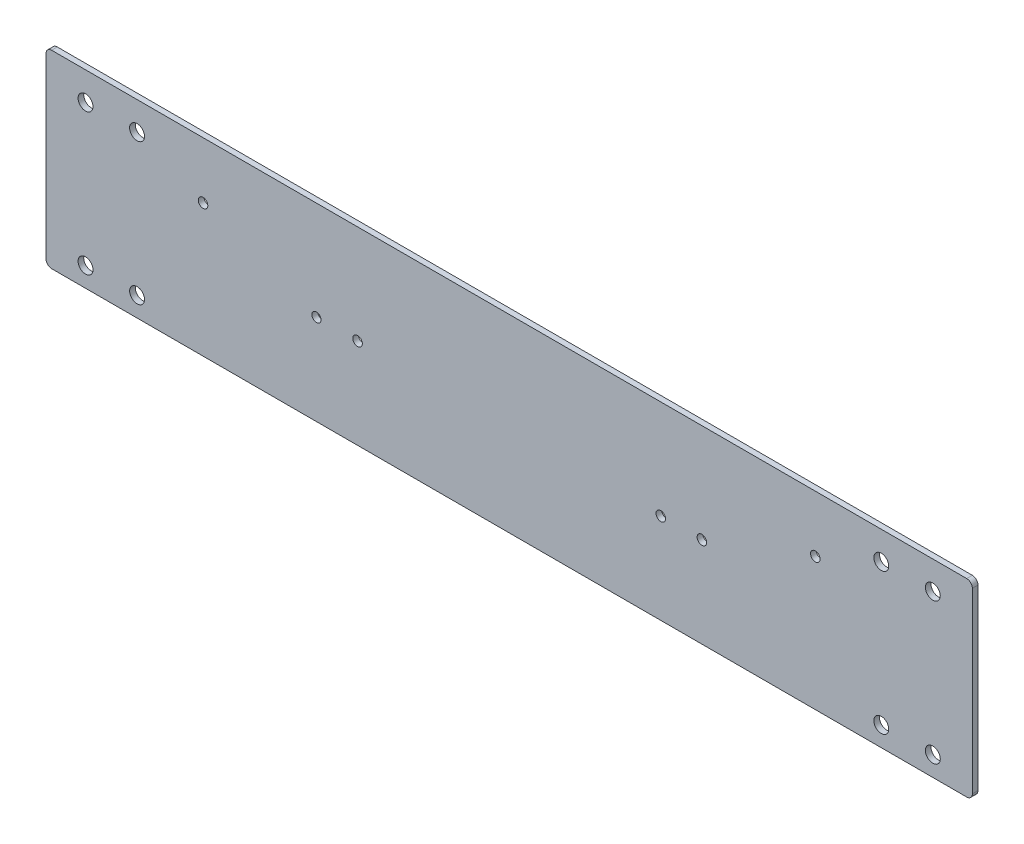
ISO-10303-21;
HEADER;
FILE_DESCRIPTION(('STEP AP214'),'2;1');
FILE_NAME('part.step','',(''),(''),'','','');
FILE_SCHEMA(('AUTOMOTIVE_DESIGN { 1 0 10303 214 1 1 1 1 }'));
ENDSEC;
DATA;
#1=APPLICATION_CONTEXT('core data for automotive mechanical design processes');
#2=APPLICATION_PROTOCOL_DEFINITION('international standard','automotive_design',2000,#1);
#3=PRODUCT_CONTEXT('',#1,'mechanical');
#4=PRODUCT('Part','Part','',(#3));
#5=PRODUCT_RELATED_PRODUCT_CATEGORY('part','',(#4));
#6=PRODUCT_DEFINITION_FORMATION('','',#4);
#7=PRODUCT_DEFINITION_CONTEXT('part definition',#1,'design');
#8=PRODUCT_DEFINITION('design','',#6,#7);
#9=PRODUCT_DEFINITION_SHAPE('','',#8);
#10=(LENGTH_UNIT() NAMED_UNIT(*) SI_UNIT(.MILLI.,.METRE.));
#11=(NAMED_UNIT(*) PLANE_ANGLE_UNIT() SI_UNIT($,.RADIAN.));
#12=(NAMED_UNIT(*) SI_UNIT($,.STERADIAN.) SOLID_ANGLE_UNIT());
#13=UNCERTAINTY_MEASURE_WITH_UNIT(LENGTH_MEASURE(1.E-05),#10,'distance_accuracy_value','');
#14=(GEOMETRIC_REPRESENTATION_CONTEXT(3) GLOBAL_UNCERTAINTY_ASSIGNED_CONTEXT((#13)) GLOBAL_UNIT_ASSIGNED_CONTEXT((#10,
#11,#12)) REPRESENTATION_CONTEXT('',''));
#15=CARTESIAN_POINT('',(0.,0.,0.));
#16=DIRECTION('',(0.,0.,1.));
#17=DIRECTION('',(1.,0.,0.));
#18=AXIS2_PLACEMENT_3D('',#15,#16,#17);
#19=CARTESIAN_POINT('',(-520.7,-106.3625,6.35));
#20=DIRECTION('',(0.,1.,0.));
#21=DIRECTION('',(0.,0.,1.));
#22=AXIS2_PLACEMENT_3D('',#19,#20,#21);
#23=PLANE('',#22);
#24=DIRECTION('',(1.,0.,0.));
#25=VECTOR('',#24,1.);
#26=CARTESIAN_POINT('',(-520.7,-106.3625,0.));
#27=LINE('',#26,#25);
#28=CARTESIAN_POINT('',(-514.35,-106.3625,0.));
#29=VERTEX_POINT('',#28);
#30=CARTESIAN_POINT('',(514.35,-106.3625,0.));
#31=VERTEX_POINT('',#30);
#32=EDGE_CURVE('E160',#29,#31,#27,.T.);
#33=ORIENTED_EDGE('',*,*,#32,.T.);
#34=DIRECTION('',(0.,0.,-1.));
#35=VECTOR('',#34,1.);
#36=CARTESIAN_POINT('',(514.35,-106.3625,6.35));
#37=LINE('',#36,#35);
#38=CARTESIAN_POINT('',(514.35,-106.3625,6.35));
#39=VERTEX_POINT('',#38);
#40=EDGE_CURVE('E147',#31,#39,#37,.F.);
#41=ORIENTED_EDGE('',*,*,#40,.T.);
#42=DIRECTION('',(1.,0.,0.));
#43=VECTOR('',#42,1.);
#44=CARTESIAN_POINT('',(-520.7,-106.3625,6.35));
#45=LINE('',#44,#43);
#46=CARTESIAN_POINT('',(-514.35,-106.3625,6.35));
#47=VERTEX_POINT('',#46);
#48=EDGE_CURVE('E162',#47,#39,#45,.T.);
#49=ORIENTED_EDGE('',*,*,#48,.F.);
#50=DIRECTION('',(0.,0.,-1.));
#51=VECTOR('',#50,1.);
#52=CARTESIAN_POINT('',(-514.35,-106.3625,6.35));
#53=LINE('',#52,#51);
#54=EDGE_CURVE('E144',#47,#29,#53,.T.);
#55=ORIENTED_EDGE('',*,*,#54,.T.);
#56=EDGE_LOOP('',(#33,#41,#49,#55));
#57=FACE_BOUND('',#56,.T.);
#58=ADVANCED_FACE('F35',(#57),#23,.F.);
#59=CARTESIAN_POINT('',(520.7,106.3625,6.35));
#60=DIRECTION('',(1.,0.,0.));
#61=DIRECTION('',(0.,0.,-1.));
#62=AXIS2_PLACEMENT_3D('',#59,#60,#61);
#63=PLANE('',#62);
#64=DIRECTION('',(0.,-1.,0.));
#65=VECTOR('',#64,1.);
#66=CARTESIAN_POINT('',(520.7,106.3625,0.));
#67=LINE('',#66,#65);
#68=CARTESIAN_POINT('',(520.7,100.0125,0.));
#69=VERTEX_POINT('',#68);
#70=CARTESIAN_POINT('',(520.7,-100.0125,0.));
#71=VERTEX_POINT('',#70);
#72=EDGE_CURVE('E118',#69,#71,#67,.T.);
#73=ORIENTED_EDGE('',*,*,#72,.F.);
#74=DIRECTION('',(0.,0.,-1.));
#75=VECTOR('',#74,1.);
#76=CARTESIAN_POINT('',(520.7,100.0125,6.35));
#77=LINE('',#76,#75);
#78=CARTESIAN_POINT('',(520.7,100.0125,6.35));
#79=VERTEX_POINT('',#78);
#80=EDGE_CURVE('E135',#69,#79,#77,.F.);
#81=ORIENTED_EDGE('',*,*,#80,.T.);
#82=DIRECTION('',(0.,-1.,0.));
#83=VECTOR('',#82,1.);
#84=CARTESIAN_POINT('',(520.7,106.3625,6.35));
#85=LINE('',#84,#83);
#86=CARTESIAN_POINT('',(520.7,-100.0125,6.35));
#87=VERTEX_POINT('',#86);
#88=EDGE_CURVE('E172',#79,#87,#85,.T.);
#89=ORIENTED_EDGE('',*,*,#88,.T.);
#90=DIRECTION('',(0.,0.,-1.));
#91=VECTOR('',#90,1.);
#92=CARTESIAN_POINT('',(520.7,-100.0125,0.));
#93=LINE('',#92,#91);
#94=EDGE_CURVE('E132',#87,#71,#93,.T.);
#95=ORIENTED_EDGE('',*,*,#94,.T.);
#96=EDGE_LOOP('',(#73,#81,#89,#95));
#97=FACE_BOUND('',#96,.T.);
#98=ADVANCED_FACE('F308',(#97),#63,.T.);
#99=CARTESIAN_POINT('',(-520.7,106.3625,6.35));
#100=DIRECTION('',(0.,1.,0.));
#101=DIRECTION('',(0.,0.,1.));
#102=AXIS2_PLACEMENT_3D('',#99,#100,#101);
#103=PLANE('',#102);
#104=DIRECTION('',(1.,0.,0.));
#105=VECTOR('',#104,1.);
#106=CARTESIAN_POINT('',(-520.7,106.3625,6.35));
#107=LINE('',#106,#105);
#108=CARTESIAN_POINT('',(-514.35,106.3625,6.35));
#109=VERTEX_POINT('',#108);
#110=CARTESIAN_POINT('',(514.35,106.3625,6.35));
#111=VERTEX_POINT('',#110);
#112=EDGE_CURVE('E123',#109,#111,#107,.T.);
#113=ORIENTED_EDGE('',*,*,#112,.T.);
#114=DIRECTION('',(0.,0.,-1.));
#115=VECTOR('',#114,1.);
#116=CARTESIAN_POINT('',(514.35,106.3625,6.35));
#117=LINE('',#116,#115);
#118=CARTESIAN_POINT('',(514.35,106.3625,0.));
#119=VERTEX_POINT('',#118);
#120=EDGE_CURVE('E110',#111,#119,#117,.T.);
#121=ORIENTED_EDGE('',*,*,#120,.T.);
#122=DIRECTION('',(1.,0.,0.));
#123=VECTOR('',#122,1.);
#124=CARTESIAN_POINT('',(-520.7,106.3625,0.));
#125=LINE('',#124,#123);
#126=CARTESIAN_POINT('',(-514.35,106.3625,0.));
#127=VERTEX_POINT('',#126);
#128=EDGE_CURVE('E103',#127,#119,#125,.T.);
#129=ORIENTED_EDGE('',*,*,#128,.F.);
#130=DIRECTION('',(0.,0.,-1.));
#131=VECTOR('',#130,1.);
#132=CARTESIAN_POINT('',(-514.35,106.3625,6.35));
#133=LINE('',#132,#131);
#134=EDGE_CURVE('E116',#127,#109,#133,.F.);
#135=ORIENTED_EDGE('',*,*,#134,.T.);
#136=EDGE_LOOP('',(#113,#121,#129,#135));
#137=FACE_BOUND('',#136,.T.);
#138=ADVANCED_FACE('F115',(#137),#103,.T.);
#139=CARTESIAN_POINT('',(-520.7,106.3625,6.35));
#140=DIRECTION('',(1.,0.,0.));
#141=DIRECTION('',(0.,0.,-1.));
#142=AXIS2_PLACEMENT_3D('',#139,#140,#141);
#143=PLANE('',#142);
#144=DIRECTION('',(0.,-1.,0.));
#145=VECTOR('',#144,1.);
#146=CARTESIAN_POINT('',(-520.7,106.3625,0.));
#147=LINE('',#146,#145);
#148=CARTESIAN_POINT('',(-520.7,100.0125,0.));
#149=VERTEX_POINT('',#148);
#150=CARTESIAN_POINT('',(-520.7,-100.0125,0.));
#151=VERTEX_POINT('',#150);
#152=EDGE_CURVE('E104',#149,#151,#147,.T.);
#153=ORIENTED_EDGE('',*,*,#152,.T.);
#154=DIRECTION('',(0.,0.,-1.));
#155=VECTOR('',#154,1.);
#156=CARTESIAN_POINT('',(-520.7,-100.0125,6.35));
#157=LINE('',#156,#155);
#158=CARTESIAN_POINT('',(-520.7,-100.0125,6.35));
#159=VERTEX_POINT('',#158);
#160=EDGE_CURVE('E11',#151,#159,#157,.F.);
#161=ORIENTED_EDGE('',*,*,#160,.T.);
#162=DIRECTION('',(0.,-1.,0.));
#163=VECTOR('',#162,1.);
#164=CARTESIAN_POINT('',(-520.7,106.3625,6.35));
#165=LINE('',#164,#163);
#166=CARTESIAN_POINT('',(-520.7,100.0125,6.35));
#167=VERTEX_POINT('',#166);
#168=EDGE_CURVE('E120',#167,#159,#165,.T.);
#169=ORIENTED_EDGE('',*,*,#168,.F.);
#170=DIRECTION('',(0.,0.,-1.));
#171=VECTOR('',#170,1.);
#172=CARTESIAN_POINT('',(-520.7,100.0125,0.));
#173=LINE('',#172,#171);
#174=EDGE_CURVE('E43',#167,#149,#173,.T.);
#175=ORIENTED_EDGE('',*,*,#174,.T.);
#176=EDGE_LOOP('',(#153,#161,#169,#175));
#177=FACE_BOUND('',#176,.T.);
#178=ADVANCED_FACE('F148',(#177),#143,.F.);
#179=CARTESIAN_POINT('',(0.,0.,6.35));
#180=DIRECTION('',(0.,0.,-1.));
#181=DIRECTION('',(-1.,0.,0.));
#182=AXIS2_PLACEMENT_3D('',#179,#180,#181);
#183=PLANE('',#182);
#184=CARTESIAN_POINT('',(344.17,42.8625,6.35));
#185=DIRECTION('',(0.,0.,1.));
#186=DIRECTION('',(1.,0.,0.));
#187=AXIS2_PLACEMENT_3D('',#184,#185,#186);
#188=CIRCLE('',#187,5.35781249998476);
#189=CARTESIAN_POINT('',(349.527812499985,42.8625,6.35));
#190=VERTEX_POINT('',#189);
#191=EDGE_CURVE('E227',#190,#190,#188,.T.);
#192=ORIENTED_EDGE('',*,*,#191,.F.);
#193=EDGE_LOOP('',(#192));
#194=FACE_BOUND('',#193,.T.);
#195=CARTESIAN_POINT('',(-170.434,-4.76249999994408,6.35));
#196=DIRECTION('',(0.,0.,1.));
#197=DIRECTION('',(1.,0.,0.));
#198=AXIS2_PLACEMENT_3D('',#195,#196,#197);
#199=CIRCLE('',#198,5.35781249998366);
#200=CARTESIAN_POINT('',(-165.076187500017,-4.76249999994408,6.35));
#201=VERTEX_POINT('',#200);
#202=EDGE_CURVE('E241',#201,#201,#199,.T.);
#203=ORIENTED_EDGE('',*,*,#202,.F.);
#204=EDGE_LOOP('',(#203));
#205=FACE_BOUND('',#204,.T.);
#206=CARTESIAN_POINT('',(170.434,-4.76249999995435,6.35));
#207=DIRECTION('',(0.,0.,1.));
#208=DIRECTION('',(1.,0.,0.));
#209=AXIS2_PLACEMENT_3D('',#206,#207,#208);
#210=CIRCLE('',#209,5.3578124999858);
#211=CARTESIAN_POINT('',(175.791812499986,-4.76249999995435,6.35));
#212=VERTEX_POINT('',#211);
#213=EDGE_CURVE('E234',#212,#212,#210,.T.);
#214=ORIENTED_EDGE('',*,*,#213,.F.);
#215=EDGE_LOOP('',(#214));
#216=FACE_BOUND('',#215,.T.);
#217=CARTESIAN_POINT('',(216.662,-4.76249999995415,6.35));
#218=DIRECTION('',(0.,0.,1.));
#219=DIRECTION('',(1.,0.,0.));
#220=AXIS2_PLACEMENT_3D('',#217,#218,#219);
#221=CIRCLE('',#220,5.35781249998577);
#222=CARTESIAN_POINT('',(222.019812499986,-4.76249999995415,6.35));
#223=VERTEX_POINT('',#222);
#224=EDGE_CURVE('E251',#223,#223,#221,.T.);
#225=ORIENTED_EDGE('',*,*,#224,.F.);
#226=EDGE_LOOP('',(#225));
#227=FACE_BOUND('',#226,.T.);
#228=CARTESIAN_POINT('',(-344.17,42.8625,6.35));
#229=DIRECTION('',(0.,0.,1.));
#230=DIRECTION('',(1.,0.,0.));
#231=AXIS2_PLACEMENT_3D('',#228,#229,#230);
#232=CIRCLE('',#231,5.3578124999847);
#233=CARTESIAN_POINT('',(-338.812187500015,42.8625,6.35));
#234=VERTEX_POINT('',#233);
#235=EDGE_CURVE('E233',#234,#234,#232,.T.);
#236=ORIENTED_EDGE('',*,*,#235,.F.);
#237=EDGE_LOOP('',(#236));
#238=FACE_BOUND('',#237,.T.);
#239=CARTESIAN_POINT('',(-216.662,-4.76249999994408,6.35));
#240=DIRECTION('',(0.,0.,1.));
#241=DIRECTION('',(1.,0.,0.));
#242=AXIS2_PLACEMENT_3D('',#239,#240,#241);
#243=CIRCLE('',#242,5.15937499998365);
#244=CARTESIAN_POINT('',(-211.502625000016,-4.76249999994408,6.35));
#245=VERTEX_POINT('',#244);
#246=EDGE_CURVE('E221',#245,#245,#243,.T.);
#247=ORIENTED_EDGE('',*,*,#246,.F.);
#248=EDGE_LOOP('',(#247));
#249=FACE_BOUND('',#248,.T.);
#250=CARTESIAN_POINT('',(476.249999999981,-84.1375,6.35));
#251=DIRECTION('',(0.,0.,1.));
#252=DIRECTION('',(1.,0.,0.));
#253=AXIS2_PLACEMENT_3D('',#250,#251,#252);
#254=CIRCLE('',#253,8.382);
#255=CARTESIAN_POINT('',(484.631999999981,-84.1375,6.35));
#256=VERTEX_POINT('',#255);
#257=EDGE_CURVE('E191',#256,#256,#254,.T.);
#258=ORIENTED_EDGE('',*,*,#257,.F.);
#259=EDGE_LOOP('',(#258));
#260=FACE_BOUND('',#259,.T.);
#261=CARTESIAN_POINT('',(-418.338,74.6125,6.35));
#262=DIRECTION('',(0.,0.,1.));
#263=DIRECTION('',(1.,0.,0.));
#264=AXIS2_PLACEMENT_3D('',#261,#262,#263);
#265=CIRCLE('',#264,8.382);
#266=CARTESIAN_POINT('',(-409.956,74.6125,6.35));
#267=VERTEX_POINT('',#266);
#268=EDGE_CURVE('E198',#267,#267,#265,.T.);
#269=ORIENTED_EDGE('',*,*,#268,.F.);
#270=EDGE_LOOP('',(#269));
#271=FACE_BOUND('',#270,.T.);
#272=CARTESIAN_POINT('',(-476.249999999973,74.6125,6.35));
#273=DIRECTION('',(0.,0.,1.));
#274=DIRECTION('',(1.,0.,0.));
#275=AXIS2_PLACEMENT_3D('',#272,#273,#274);
#276=CIRCLE('',#275,8.382);
#277=CARTESIAN_POINT('',(-467.867999999973,74.6125,6.35));
#278=VERTEX_POINT('',#277);
#279=EDGE_CURVE('E179',#278,#278,#276,.T.);
#280=ORIENTED_EDGE('',*,*,#279,.F.);
#281=EDGE_LOOP('',(#280));
#282=FACE_BOUND('',#281,.T.);
#283=CARTESIAN_POINT('',(418.310341603568,74.6125,6.35));
#284=DIRECTION('',(0.,0.,1.));
#285=DIRECTION('',(1.,0.,0.));
#286=AXIS2_PLACEMENT_3D('',#283,#284,#285);
#287=CIRCLE('',#286,8.382);
#288=CARTESIAN_POINT('',(426.692341603568,74.6125,6.35));
#289=VERTEX_POINT('',#288);
#290=EDGE_CURVE('E186',#289,#289,#287,.T.);
#291=ORIENTED_EDGE('',*,*,#290,.F.);
#292=EDGE_LOOP('',(#291));
#293=FACE_BOUND('',#292,.T.);
#294=CARTESIAN_POINT('',(-418.310341686,-84.1375,6.35));
#295=DIRECTION('',(0.,0.,1.));
#296=DIRECTION('',(1.,0.,0.));
#297=AXIS2_PLACEMENT_3D('',#294,#295,#296);
#298=CIRCLE('',#297,8.382);
#299=CARTESIAN_POINT('',(-409.928341686,-84.1375,6.35));
#300=VERTEX_POINT('',#299);
#301=EDGE_CURVE('E215',#300,#300,#298,.T.);
#302=ORIENTED_EDGE('',*,*,#301,.F.);
#303=EDGE_LOOP('',(#302));
#304=FACE_BOUND('',#303,.T.);
#305=CARTESIAN_POINT('',(-476.249999999973,-84.1375,6.35));
#306=DIRECTION('',(0.,0.,1.));
#307=DIRECTION('',(1.,0.,0.));
#308=AXIS2_PLACEMENT_3D('',#305,#306,#307);
#309=CIRCLE('',#308,8.382);
#310=CARTESIAN_POINT('',(-467.867999999973,-84.1375,6.35));
#311=VERTEX_POINT('',#310);
#312=EDGE_CURVE('E203',#311,#311,#309,.T.);
#313=ORIENTED_EDGE('',*,*,#312,.F.);
#314=EDGE_LOOP('',(#313));
#315=FACE_BOUND('',#314,.T.);
#316=CARTESIAN_POINT('',(418.310341686,-84.1375,6.35));
#317=DIRECTION('',(0.,0.,1.));
#318=DIRECTION('',(1.,0.,0.));
#319=AXIS2_PLACEMENT_3D('',#316,#317,#318);
#320=CIRCLE('',#319,8.38199999999994);
#321=CARTESIAN_POINT('',(426.692341686,-84.1375,6.35));
#322=VERTEX_POINT('',#321);
#323=EDGE_CURVE('E210',#322,#322,#320,.T.);
#324=ORIENTED_EDGE('',*,*,#323,.F.);
#325=EDGE_LOOP('',(#324));
#326=FACE_BOUND('',#325,.T.);
#327=CARTESIAN_POINT('',(476.249999999981,74.6125,6.35));
#328=DIRECTION('',(0.,0.,1.));
#329=DIRECTION('',(1.,0.,0.));
#330=AXIS2_PLACEMENT_3D('',#327,#328,#329);
#331=CIRCLE('',#330,8.382);
#332=CARTESIAN_POINT('',(484.631999999981,74.6125,6.35));
#333=VERTEX_POINT('',#332);
#334=EDGE_CURVE('E168',#333,#333,#331,.T.);
#335=ORIENTED_EDGE('',*,*,#334,.F.);
#336=EDGE_LOOP('',(#335));
#337=FACE_BOUND('',#336,.T.);
#338=ORIENTED_EDGE('',*,*,#88,.F.);
#339=CARTESIAN_POINT('',(514.35,100.0125,6.35));
#340=DIRECTION('',(0.,0.,-1.));
#341=DIRECTION('',(-1.,0.,0.));
#342=AXIS2_PLACEMENT_3D('',#339,#340,#341);
#343=CIRCLE('',#342,6.35);
#344=EDGE_CURVE('E142',#79,#111,#343,.F.);
#345=ORIENTED_EDGE('',*,*,#344,.T.);
#346=ORIENTED_EDGE('',*,*,#112,.F.);
#347=CARTESIAN_POINT('',(-514.35,100.0125,6.35));
#348=DIRECTION('',(0.,0.,-1.));
#349=DIRECTION('',(-1.,0.,0.));
#350=AXIS2_PLACEMENT_3D('',#347,#348,#349);
#351=CIRCLE('',#350,6.35);
#352=EDGE_CURVE('E55',#109,#167,#351,.F.);
#353=ORIENTED_EDGE('',*,*,#352,.T.);
#354=ORIENTED_EDGE('',*,*,#168,.T.);
#355=CARTESIAN_POINT('',(-514.35,-100.0125,6.35));
#356=DIRECTION('',(0.,0.,-1.));
#357=DIRECTION('',(-1.,0.,0.));
#358=AXIS2_PLACEMENT_3D('',#355,#356,#357);
#359=CIRCLE('',#358,6.35);
#360=EDGE_CURVE('E138',#159,#47,#359,.F.);
#361=ORIENTED_EDGE('',*,*,#360,.T.);
#362=ORIENTED_EDGE('',*,*,#48,.T.);
#363=CARTESIAN_POINT('',(514.35,-100.0125,6.35));
#364=DIRECTION('',(0.,0.,-1.));
#365=DIRECTION('',(-1.,0.,0.));
#366=AXIS2_PLACEMENT_3D('',#363,#364,#365);
#367=CIRCLE('',#366,6.35);
#368=EDGE_CURVE('E140',#39,#87,#367,.F.);
#369=ORIENTED_EDGE('',*,*,#368,.T.);
#370=EDGE_LOOP('',(#338,#345,#346,#353,#354,#361,#362,#369));
#371=FACE_BOUND('',#370,.T.);
#372=ADVANCED_FACE('F151',(#194,#205,#216,#227,#238,#249,#260,#271,#282,#293,#304,#315,#326,
#337,#371),#183,.F.);
#373=CARTESIAN_POINT('',(0.,0.,0.));
#374=DIRECTION('',(0.,0.,-1.));
#375=DIRECTION('',(-1.,0.,0.));
#376=AXIS2_PLACEMENT_3D('',#373,#374,#375);
#377=PLANE('',#376);
#378=CARTESIAN_POINT('',(344.17,42.8625,0.));
#379=DIRECTION('',(0.,0.,1.));
#380=DIRECTION('',(1.,0.,0.));
#381=AXIS2_PLACEMENT_3D('',#378,#379,#380);
#382=CIRCLE('',#381,5.35781249998476);
#383=CARTESIAN_POINT('',(349.527812499985,42.8625,0.));
#384=VERTEX_POINT('',#383);
#385=EDGE_CURVE('E230',#384,#384,#382,.T.);
#386=ORIENTED_EDGE('',*,*,#385,.T.);
#387=EDGE_LOOP('',(#386));
#388=FACE_BOUND('',#387,.T.);
#389=CARTESIAN_POINT('',(-170.434,-4.76249999994408,0.));
#390=DIRECTION('',(0.,0.,1.));
#391=DIRECTION('',(1.,0.,0.));
#392=AXIS2_PLACEMENT_3D('',#389,#390,#391);
#393=CIRCLE('',#392,5.35781249998366);
#394=CARTESIAN_POINT('',(-165.076187500017,-4.76249999994408,0.));
#395=VERTEX_POINT('',#394);
#396=EDGE_CURVE('E224',#395,#395,#393,.T.);
#397=ORIENTED_EDGE('',*,*,#396,.T.);
#398=EDGE_LOOP('',(#397));
#399=FACE_BOUND('',#398,.T.);
#400=CARTESIAN_POINT('',(170.434,-4.76249999995435,0.));
#401=DIRECTION('',(0.,0.,1.));
#402=DIRECTION('',(1.,0.,0.));
#403=AXIS2_PLACEMENT_3D('',#400,#401,#402);
#404=CIRCLE('',#403,5.3578124999858);
#405=CARTESIAN_POINT('',(175.791812499986,-4.76249999995435,0.));
#406=VERTEX_POINT('',#405);
#407=EDGE_CURVE('E237',#406,#406,#404,.T.);
#408=ORIENTED_EDGE('',*,*,#407,.T.);
#409=EDGE_LOOP('',(#408));
#410=FACE_BOUND('',#409,.T.);
#411=CARTESIAN_POINT('',(216.662,-4.76249999995415,0.));
#412=DIRECTION('',(0.,0.,1.));
#413=DIRECTION('',(1.,0.,0.));
#414=AXIS2_PLACEMENT_3D('',#411,#412,#413);
#415=CIRCLE('',#414,5.35781249998577);
#416=CARTESIAN_POINT('',(222.019812499986,-4.76249999995415,0.));
#417=VERTEX_POINT('',#416);
#418=EDGE_CURVE('E238',#417,#417,#415,.T.);
#419=ORIENTED_EDGE('',*,*,#418,.T.);
#420=EDGE_LOOP('',(#419));
#421=FACE_BOUND('',#420,.T.);
#422=CARTESIAN_POINT('',(-344.17,42.8625,0.));
#423=DIRECTION('',(0.,0.,1.));
#424=DIRECTION('',(1.,0.,0.));
#425=AXIS2_PLACEMENT_3D('',#422,#423,#424);
#426=CIRCLE('',#425,5.3578124999847);
#427=CARTESIAN_POINT('',(-338.812187500015,42.8625,0.));
#428=VERTEX_POINT('',#427);
#429=EDGE_CURVE('E248',#428,#428,#426,.T.);
#430=ORIENTED_EDGE('',*,*,#429,.T.);
#431=EDGE_LOOP('',(#430));
#432=FACE_BOUND('',#431,.T.);
#433=CARTESIAN_POINT('',(-216.662,-4.76249999994408,0.));
#434=DIRECTION('',(0.,0.,1.));
#435=DIRECTION('',(1.,0.,0.));
#436=AXIS2_PLACEMENT_3D('',#433,#434,#435);
#437=CIRCLE('',#436,5.15937499998365);
#438=CARTESIAN_POINT('',(-211.502625000016,-4.76249999994408,0.));
#439=VERTEX_POINT('',#438);
#440=EDGE_CURVE('E218',#439,#439,#437,.T.);
#441=ORIENTED_EDGE('',*,*,#440,.T.);
#442=EDGE_LOOP('',(#441));
#443=FACE_BOUND('',#442,.T.);
#444=CARTESIAN_POINT('',(476.249999999981,-84.1375,0.));
#445=DIRECTION('',(0.,0.,1.));
#446=DIRECTION('',(1.,0.,0.));
#447=AXIS2_PLACEMENT_3D('',#444,#445,#446);
#448=CIRCLE('',#447,8.382);
#449=CARTESIAN_POINT('',(484.631999999981,-84.1375,0.));
#450=VERTEX_POINT('',#449);
#451=EDGE_CURVE('E194',#450,#450,#448,.T.);
#452=ORIENTED_EDGE('',*,*,#451,.T.);
#453=EDGE_LOOP('',(#452));
#454=FACE_BOUND('',#453,.T.);
#455=CARTESIAN_POINT('',(-418.338,74.6125,0.));
#456=DIRECTION('',(0.,0.,1.));
#457=DIRECTION('',(1.,0.,0.));
#458=AXIS2_PLACEMENT_3D('',#455,#456,#457);
#459=CIRCLE('',#458,8.382);
#460=CARTESIAN_POINT('',(-409.956,74.6125,0.));
#461=VERTEX_POINT('',#460);
#462=EDGE_CURVE('E183',#461,#461,#459,.T.);
#463=ORIENTED_EDGE('',*,*,#462,.T.);
#464=EDGE_LOOP('',(#463));
#465=FACE_BOUND('',#464,.T.);
#466=CARTESIAN_POINT('',(-476.249999999973,74.6125,0.));
#467=DIRECTION('',(0.,0.,1.));
#468=DIRECTION('',(1.,0.,0.));
#469=AXIS2_PLACEMENT_3D('',#466,#467,#468);
#470=CIRCLE('',#469,8.382);
#471=CARTESIAN_POINT('',(-467.867999999973,74.6125,0.));
#472=VERTEX_POINT('',#471);
#473=EDGE_CURVE('E182',#472,#472,#470,.T.);
#474=ORIENTED_EDGE('',*,*,#473,.T.);
#475=EDGE_LOOP('',(#474));
#476=FACE_BOUND('',#475,.T.);
#477=CARTESIAN_POINT('',(418.310341603568,74.6125,0.));
#478=DIRECTION('',(0.,0.,1.));
#479=DIRECTION('',(1.,0.,0.));
#480=AXIS2_PLACEMENT_3D('',#477,#478,#479);
#481=CIRCLE('',#480,8.382);
#482=CARTESIAN_POINT('',(426.692341603568,74.6125,0.));
#483=VERTEX_POINT('',#482);
#484=EDGE_CURVE('E177',#483,#483,#481,.T.);
#485=ORIENTED_EDGE('',*,*,#484,.T.);
#486=EDGE_LOOP('',(#485));
#487=FACE_BOUND('',#486,.T.);
#488=CARTESIAN_POINT('',(-418.310341686,-84.1375,0.));
#489=DIRECTION('',(0.,0.,1.));
#490=DIRECTION('',(1.,0.,0.));
#491=AXIS2_PLACEMENT_3D('',#488,#489,#490);
#492=CIRCLE('',#491,8.382);
#493=CARTESIAN_POINT('',(-409.928341686,-84.1375,0.));
#494=VERTEX_POINT('',#493);
#495=EDGE_CURVE('E207',#494,#494,#492,.T.);
#496=ORIENTED_EDGE('',*,*,#495,.T.);
#497=EDGE_LOOP('',(#496));
#498=FACE_BOUND('',#497,.T.);
#499=CARTESIAN_POINT('',(-476.249999999973,-84.1375,0.));
#500=DIRECTION('',(0.,0.,1.));
#501=DIRECTION('',(1.,0.,0.));
#502=AXIS2_PLACEMENT_3D('',#499,#500,#501);
#503=CIRCLE('',#502,8.382);
#504=CARTESIAN_POINT('',(-467.867999999973,-84.1375,0.));
#505=VERTEX_POINT('',#504);
#506=EDGE_CURVE('E206',#505,#505,#503,.T.);
#507=ORIENTED_EDGE('',*,*,#506,.T.);
#508=EDGE_LOOP('',(#507));
#509=FACE_BOUND('',#508,.T.);
#510=CARTESIAN_POINT('',(418.310341686,-84.1375,0.));
#511=DIRECTION('',(0.,0.,1.));
#512=DIRECTION('',(1.,0.,0.));
#513=AXIS2_PLACEMENT_3D('',#510,#511,#512);
#514=CIRCLE('',#513,8.38199999999994);
#515=CARTESIAN_POINT('',(426.692341686,-84.1375,0.));
#516=VERTEX_POINT('',#515);
#517=EDGE_CURVE('E195',#516,#516,#514,.T.);
#518=ORIENTED_EDGE('',*,*,#517,.T.);
#519=EDGE_LOOP('',(#518));
#520=FACE_BOUND('',#519,.T.);
#521=CARTESIAN_POINT('',(476.249999999981,74.6125,0.));
#522=DIRECTION('',(0.,0.,1.));
#523=DIRECTION('',(1.,0.,0.));
#524=AXIS2_PLACEMENT_3D('',#521,#522,#523);
#525=CIRCLE('',#524,8.382);
#526=CARTESIAN_POINT('',(484.631999999981,74.6125,0.));
#527=VERTEX_POINT('',#526);
#528=EDGE_CURVE('E164',#527,#527,#525,.T.);
#529=ORIENTED_EDGE('',*,*,#528,.T.);
#530=EDGE_LOOP('',(#529));
#531=FACE_BOUND('',#530,.T.);
#532=ORIENTED_EDGE('',*,*,#128,.T.);
#533=CARTESIAN_POINT('',(514.35,100.0125,0.));
#534=DIRECTION('',(0.,0.,-1.));
#535=DIRECTION('',(-1.,0.,0.));
#536=AXIS2_PLACEMENT_3D('',#533,#534,#535);
#537=CIRCLE('',#536,6.35);
#538=EDGE_CURVE('E130',#119,#69,#537,.T.);
#539=ORIENTED_EDGE('',*,*,#538,.T.);
#540=ORIENTED_EDGE('',*,*,#72,.T.);
#541=CARTESIAN_POINT('',(514.35,-100.0125,0.));
#542=DIRECTION('',(0.,0.,-1.));
#543=DIRECTION('',(-1.,0.,0.));
#544=AXIS2_PLACEMENT_3D('',#541,#542,#543);
#545=CIRCLE('',#544,6.35);
#546=EDGE_CURVE('E128',#71,#31,#545,.T.);
#547=ORIENTED_EDGE('',*,*,#546,.T.);
#548=ORIENTED_EDGE('',*,*,#32,.F.);
#549=CARTESIAN_POINT('',(-514.35,-100.0125,0.));
#550=DIRECTION('',(0.,0.,-1.));
#551=DIRECTION('',(-1.,0.,0.));
#552=AXIS2_PLACEMENT_3D('',#549,#550,#551);
#553=CIRCLE('',#552,6.35);
#554=EDGE_CURVE('E109',#29,#151,#553,.T.);
#555=ORIENTED_EDGE('',*,*,#554,.T.);
#556=ORIENTED_EDGE('',*,*,#152,.F.);
#557=CARTESIAN_POINT('',(-514.35,100.0125,0.));
#558=DIRECTION('',(0.,0.,-1.));
#559=DIRECTION('',(-1.,0.,0.));
#560=AXIS2_PLACEMENT_3D('',#557,#558,#559);
#561=CIRCLE('',#560,6.35);
#562=EDGE_CURVE('E100',#149,#127,#561,.T.);
#563=ORIENTED_EDGE('',*,*,#562,.T.);
#564=EDGE_LOOP('',(#532,#539,#540,#547,#548,#555,#556,#563));
#565=FACE_BOUND('',#564,.T.);
#566=ADVANCED_FACE('F102',(#388,#399,#410,#421,#432,#443,#454,#465,#476,#487,#498,#509,#520,
#531,#565),#377,.T.);
#567=CARTESIAN_POINT('',(476.249999999981,74.6125,0.));
#568=DIRECTION('',(0.,0.,1.));
#569=DIRECTION('',(1.,0.,0.));
#570=AXIS2_PLACEMENT_3D('',#567,#568,#569);
#571=CYLINDRICAL_SURFACE('',#570,8.382);
#572=ORIENTED_EDGE('',*,*,#528,.F.);
#573=EDGE_LOOP('',(#572));
#574=FACE_BOUND('',#573,.T.);
#575=ORIENTED_EDGE('',*,*,#334,.T.);
#576=EDGE_LOOP('',(#575));
#577=FACE_BOUND('',#576,.T.);
#578=ADVANCED_FACE('F291',(#574,#577),#571,.F.);
#579=CARTESIAN_POINT('',(418.310341686,-84.1375,0.));
#580=DIRECTION('',(0.,0.,1.));
#581=DIRECTION('',(1.,0.,0.));
#582=AXIS2_PLACEMENT_3D('',#579,#580,#581);
#583=CYLINDRICAL_SURFACE('',#582,8.38199999999994);
#584=ORIENTED_EDGE('',*,*,#517,.F.);
#585=EDGE_LOOP('',(#584));
#586=FACE_BOUND('',#585,.T.);
#587=ORIENTED_EDGE('',*,*,#323,.T.);
#588=EDGE_LOOP('',(#587));
#589=FACE_BOUND('',#588,.T.);
#590=ADVANCED_FACE('F293',(#586,#589),#583,.F.);
#591=CARTESIAN_POINT('',(-476.249999999973,-84.1375,0.));
#592=DIRECTION('',(0.,0.,1.));
#593=DIRECTION('',(1.,0.,0.));
#594=AXIS2_PLACEMENT_3D('',#591,#592,#593);
#595=CYLINDRICAL_SURFACE('',#594,8.382);
#596=ORIENTED_EDGE('',*,*,#506,.F.);
#597=EDGE_LOOP('',(#596));
#598=FACE_BOUND('',#597,.T.);
#599=ORIENTED_EDGE('',*,*,#312,.T.);
#600=EDGE_LOOP('',(#599));
#601=FACE_BOUND('',#600,.T.);
#602=ADVANCED_FACE('F300',(#598,#601),#595,.F.);
#603=CARTESIAN_POINT('',(-418.310341686,-84.1375,0.));
#604=DIRECTION('',(0.,0.,1.));
#605=DIRECTION('',(1.,0.,0.));
#606=AXIS2_PLACEMENT_3D('',#603,#604,#605);
#607=CYLINDRICAL_SURFACE('',#606,8.382);
#608=ORIENTED_EDGE('',*,*,#495,.F.);
#609=EDGE_LOOP('',(#608));
#610=FACE_BOUND('',#609,.T.);
#611=ORIENTED_EDGE('',*,*,#301,.T.);
#612=EDGE_LOOP('',(#611));
#613=FACE_BOUND('',#612,.T.);
#614=ADVANCED_FACE('F479',(#610,#613),#607,.F.);
#615=CARTESIAN_POINT('',(418.310341603568,74.6125,0.));
#616=DIRECTION('',(0.,0.,1.));
#617=DIRECTION('',(1.,0.,0.));
#618=AXIS2_PLACEMENT_3D('',#615,#616,#617);
#619=CYLINDRICAL_SURFACE('',#618,8.382);
#620=ORIENTED_EDGE('',*,*,#484,.F.);
#621=EDGE_LOOP('',(#620));
#622=FACE_BOUND('',#621,.T.);
#623=ORIENTED_EDGE('',*,*,#290,.T.);
#624=EDGE_LOOP('',(#623));
#625=FACE_BOUND('',#624,.T.);
#626=ADVANCED_FACE('F470',(#622,#625),#619,.F.);
#627=CARTESIAN_POINT('',(-476.249999999973,74.6125,0.));
#628=DIRECTION('',(0.,0.,1.));
#629=DIRECTION('',(1.,0.,0.));
#630=AXIS2_PLACEMENT_3D('',#627,#628,#629);
#631=CYLINDRICAL_SURFACE('',#630,8.382);
#632=ORIENTED_EDGE('',*,*,#473,.F.);
#633=EDGE_LOOP('',(#632));
#634=FACE_BOUND('',#633,.T.);
#635=ORIENTED_EDGE('',*,*,#279,.T.);
#636=EDGE_LOOP('',(#635));
#637=FACE_BOUND('',#636,.T.);
#638=ADVANCED_FACE('F460',(#634,#637),#631,.F.);
#639=CARTESIAN_POINT('',(-418.338,74.6125,0.));
#640=DIRECTION('',(0.,0.,1.));
#641=DIRECTION('',(1.,0.,0.));
#642=AXIS2_PLACEMENT_3D('',#639,#640,#641);
#643=CYLINDRICAL_SURFACE('',#642,8.382);
#644=ORIENTED_EDGE('',*,*,#462,.F.);
#645=EDGE_LOOP('',(#644));
#646=FACE_BOUND('',#645,.T.);
#647=ORIENTED_EDGE('',*,*,#268,.T.);
#648=EDGE_LOOP('',(#647));
#649=FACE_BOUND('',#648,.T.);
#650=ADVANCED_FACE('F450',(#646,#649),#643,.F.);
#651=CARTESIAN_POINT('',(476.249999999981,-84.1375,0.));
#652=DIRECTION('',(0.,0.,1.));
#653=DIRECTION('',(1.,0.,0.));
#654=AXIS2_PLACEMENT_3D('',#651,#652,#653);
#655=CYLINDRICAL_SURFACE('',#654,8.382);
#656=ORIENTED_EDGE('',*,*,#451,.F.);
#657=EDGE_LOOP('',(#656));
#658=FACE_BOUND('',#657,.T.);
#659=ORIENTED_EDGE('',*,*,#257,.T.);
#660=EDGE_LOOP('',(#659));
#661=FACE_BOUND('',#660,.T.);
#662=ADVANCED_FACE('F440',(#658,#661),#655,.F.);
#663=CARTESIAN_POINT('',(-216.662,-4.76249999994408,0.));
#664=DIRECTION('',(0.,0.,1.));
#665=DIRECTION('',(1.,0.,0.));
#666=AXIS2_PLACEMENT_3D('',#663,#664,#665);
#667=CYLINDRICAL_SURFACE('',#666,5.15937499998365);
#668=ORIENTED_EDGE('',*,*,#440,.F.);
#669=EDGE_LOOP('',(#668));
#670=FACE_BOUND('',#669,.T.);
#671=ORIENTED_EDGE('',*,*,#246,.T.);
#672=EDGE_LOOP('',(#671));
#673=FACE_BOUND('',#672,.T.);
#674=ADVANCED_FACE('F430',(#670,#673),#667,.F.);
#675=CARTESIAN_POINT('',(-344.17,42.8625,0.));
#676=DIRECTION('',(0.,0.,1.));
#677=DIRECTION('',(1.,0.,0.));
#678=AXIS2_PLACEMENT_3D('',#675,#676,#677);
#679=CYLINDRICAL_SURFACE('',#678,5.3578124999847);
#680=ORIENTED_EDGE('',*,*,#429,.F.);
#681=EDGE_LOOP('',(#680));
#682=FACE_BOUND('',#681,.T.);
#683=ORIENTED_EDGE('',*,*,#235,.T.);
#684=EDGE_LOOP('',(#683));
#685=FACE_BOUND('',#684,.T.);
#686=ADVANCED_FACE('F263',(#682,#685),#679,.F.);
#687=CARTESIAN_POINT('',(216.662,-4.76249999995415,0.));
#688=DIRECTION('',(0.,0.,1.));
#689=DIRECTION('',(1.,0.,0.));
#690=AXIS2_PLACEMENT_3D('',#687,#688,#689);
#691=CYLINDRICAL_SURFACE('',#690,5.35781249998577);
#692=ORIENTED_EDGE('',*,*,#418,.F.);
#693=EDGE_LOOP('',(#692));
#694=FACE_BOUND('',#693,.T.);
#695=ORIENTED_EDGE('',*,*,#224,.T.);
#696=EDGE_LOOP('',(#695));
#697=FACE_BOUND('',#696,.T.);
#698=ADVANCED_FACE('F259',(#694,#697),#691,.F.);
#699=CARTESIAN_POINT('',(170.434,-4.76249999995435,0.));
#700=DIRECTION('',(0.,0.,1.));
#701=DIRECTION('',(1.,0.,0.));
#702=AXIS2_PLACEMENT_3D('',#699,#700,#701);
#703=CYLINDRICAL_SURFACE('',#702,5.3578124999858);
#704=ORIENTED_EDGE('',*,*,#407,.F.);
#705=EDGE_LOOP('',(#704));
#706=FACE_BOUND('',#705,.T.);
#707=ORIENTED_EDGE('',*,*,#213,.T.);
#708=EDGE_LOOP('',(#707));
#709=FACE_BOUND('',#708,.T.);
#710=ADVANCED_FACE('F262',(#706,#709),#703,.F.);
#711=CARTESIAN_POINT('',(-170.434,-4.76249999994408,0.));
#712=DIRECTION('',(0.,0.,1.));
#713=DIRECTION('',(1.,0.,0.));
#714=AXIS2_PLACEMENT_3D('',#711,#712,#713);
#715=CYLINDRICAL_SURFACE('',#714,5.35781249998366);
#716=ORIENTED_EDGE('',*,*,#396,.F.);
#717=EDGE_LOOP('',(#716));
#718=FACE_BOUND('',#717,.T.);
#719=ORIENTED_EDGE('',*,*,#202,.T.);
#720=EDGE_LOOP('',(#719));
#721=FACE_BOUND('',#720,.T.);
#722=ADVANCED_FACE('F396',(#718,#721),#715,.F.);
#723=CARTESIAN_POINT('',(344.17,42.8625,0.));
#724=DIRECTION('',(0.,0.,1.));
#725=DIRECTION('',(1.,0.,0.));
#726=AXIS2_PLACEMENT_3D('',#723,#724,#725);
#727=CYLINDRICAL_SURFACE('',#726,5.35781249998476);
#728=ORIENTED_EDGE('',*,*,#385,.F.);
#729=EDGE_LOOP('',(#728));
#730=FACE_BOUND('',#729,.T.);
#731=ORIENTED_EDGE('',*,*,#191,.T.);
#732=EDGE_LOOP('',(#731));
#733=FACE_BOUND('',#732,.T.);
#734=ADVANCED_FACE('F321',(#730,#733),#727,.F.);
#735=CARTESIAN_POINT('',(514.35,100.0125,6.35));
#736=DIRECTION('',(0.,0.,-1.));
#737=DIRECTION('',(-1.,0.,0.));
#738=AXIS2_PLACEMENT_3D('',#735,#736,#737);
#739=CYLINDRICAL_SURFACE('',#738,6.35);
#740=ORIENTED_EDGE('',*,*,#344,.F.);
#741=ORIENTED_EDGE('',*,*,#80,.F.);
#742=ORIENTED_EDGE('',*,*,#538,.F.);
#743=ORIENTED_EDGE('',*,*,#120,.F.);
#744=EDGE_LOOP('',(#740,#741,#742,#743));
#745=FACE_BOUND('',#744,.T.);
#746=ADVANCED_FACE('F317',(#745),#739,.T.);
#747=CARTESIAN_POINT('',(514.35,-100.0125,6.35));
#748=DIRECTION('',(0.,0.,1.));
#749=DIRECTION('',(1.,0.,0.));
#750=AXIS2_PLACEMENT_3D('',#747,#748,#749);
#751=CYLINDRICAL_SURFACE('',#750,6.35);
#752=ORIENTED_EDGE('',*,*,#368,.F.);
#753=ORIENTED_EDGE('',*,*,#40,.F.);
#754=ORIENTED_EDGE('',*,*,#546,.F.);
#755=ORIENTED_EDGE('',*,*,#94,.F.);
#756=EDGE_LOOP('',(#752,#753,#754,#755));
#757=FACE_BOUND('',#756,.T.);
#758=ADVANCED_FACE('F320',(#757),#751,.T.);
#759=CARTESIAN_POINT('',(-514.35,-100.0125,6.35));
#760=DIRECTION('',(0.,0.,-1.));
#761=DIRECTION('',(-1.,0.,0.));
#762=AXIS2_PLACEMENT_3D('',#759,#760,#761);
#763=CYLINDRICAL_SURFACE('',#762,6.35);
#764=ORIENTED_EDGE('',*,*,#360,.F.);
#765=ORIENTED_EDGE('',*,*,#160,.F.);
#766=ORIENTED_EDGE('',*,*,#554,.F.);
#767=ORIENTED_EDGE('',*,*,#54,.F.);
#768=EDGE_LOOP('',(#764,#765,#766,#767));
#769=FACE_BOUND('',#768,.T.);
#770=ADVANCED_FACE('F156',(#769),#763,.T.);
#771=CARTESIAN_POINT('',(-514.35,100.0125,6.35));
#772=DIRECTION('',(0.,0.,1.));
#773=DIRECTION('',(1.,0.,0.));
#774=AXIS2_PLACEMENT_3D('',#771,#772,#773);
#775=CYLINDRICAL_SURFACE('',#774,6.35);
#776=ORIENTED_EDGE('',*,*,#352,.F.);
#777=ORIENTED_EDGE('',*,*,#134,.F.);
#778=ORIENTED_EDGE('',*,*,#562,.F.);
#779=ORIENTED_EDGE('',*,*,#174,.F.);
#780=EDGE_LOOP('',(#776,#777,#778,#779));
#781=FACE_BOUND('',#780,.T.);
#782=ADVANCED_FACE('F37',(#781),#775,.T.);
#783=CLOSED_SHELL('',(#58,#98,#138,#178,#372,#566,#578,#590,#602,#614,#626,#638,#650,#662,#674,
#686,#698,#710,#722,#734,#746,#758,#770,#782));
#784=MANIFOLD_SOLID_BREP('B2',#783);
#785=ADVANCED_BREP_SHAPE_REPRESENTATION('',(#18,#784),#14);
#786=SHAPE_DEFINITION_REPRESENTATION(#9,#785);
ENDSEC;
END-ISO-10303-21;
